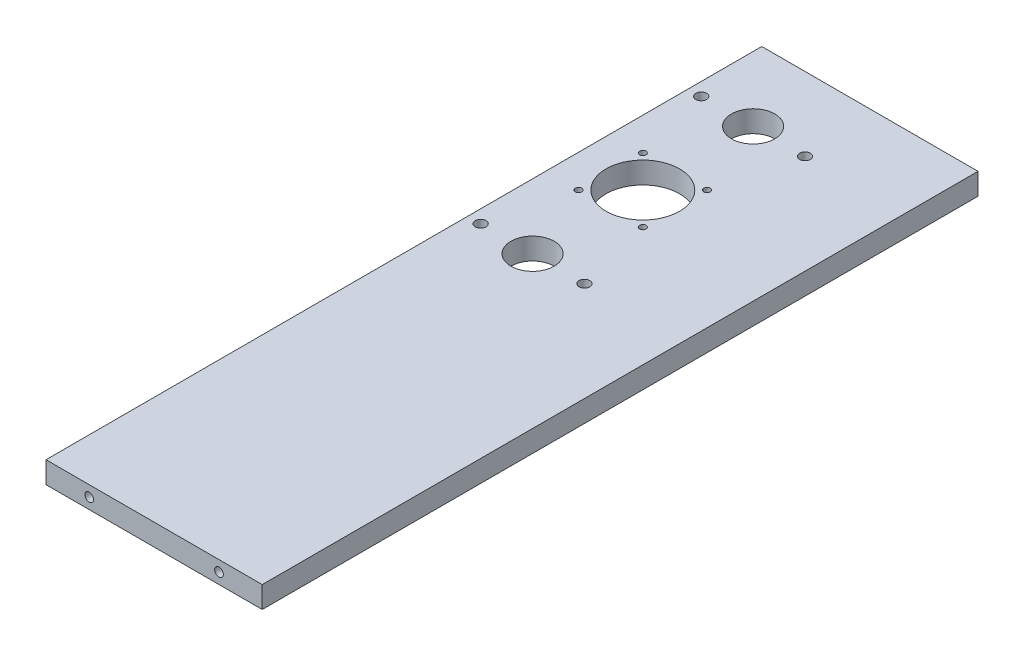
ISO-10303-21;
HEADER;
FILE_DESCRIPTION(('STEP AP214'),'2;1');
FILE_NAME('part.step','',(''),(''),'','','');
FILE_SCHEMA(('AUTOMOTIVE_DESIGN { 1 0 10303 214 1 1 1 1 }'));
ENDSEC;
DATA;
#1=APPLICATION_CONTEXT('core data for automotive mechanical design processes');
#2=APPLICATION_PROTOCOL_DEFINITION('international standard','automotive_design',2000,#1);
#3=PRODUCT_CONTEXT('',#1,'mechanical');
#4=PRODUCT('Part','Part','',(#3));
#5=PRODUCT_RELATED_PRODUCT_CATEGORY('part','',(#4));
#6=PRODUCT_DEFINITION_FORMATION('','',#4);
#7=PRODUCT_DEFINITION_CONTEXT('part definition',#1,'design');
#8=PRODUCT_DEFINITION('design','',#6,#7);
#9=PRODUCT_DEFINITION_SHAPE('','',#8);
#10=(LENGTH_UNIT() NAMED_UNIT(*) SI_UNIT(.MILLI.,.METRE.));
#11=(NAMED_UNIT(*) PLANE_ANGLE_UNIT() SI_UNIT($,.RADIAN.));
#12=(NAMED_UNIT(*) SI_UNIT($,.STERADIAN.) SOLID_ANGLE_UNIT());
#13=UNCERTAINTY_MEASURE_WITH_UNIT(LENGTH_MEASURE(1.E-05),#10,'distance_accuracy_value','');
#14=(GEOMETRIC_REPRESENTATION_CONTEXT(3) GLOBAL_UNCERTAINTY_ASSIGNED_CONTEXT((#13)) GLOBAL_UNIT_ASSIGNED_CONTEXT((#10,
#11,#12)) REPRESENTATION_CONTEXT('',''));
#15=CARTESIAN_POINT('',(0.,0.,0.));
#16=DIRECTION('',(0.,0.,1.));
#17=DIRECTION('',(1.,0.,0.));
#18=AXIS2_PLACEMENT_3D('',#15,#16,#17);
#19=CARTESIAN_POINT('',(-79.2239334984175,10.,-31.1640997523736));
#20=DIRECTION('',(0.,0.,1.));
#21=DIRECTION('',(1.,0.,0.));
#22=AXIS2_PLACEMENT_3D('',#19,#20,#21);
#23=PLANE('',#22);
#24=DIRECTION('',(-1.,0.,0.));
#25=VECTOR('',#24,1.);
#26=CARTESIAN_POINT('',(-79.2239334984175,0.,-31.1640997523736));
#27=LINE('',#26,#25);
#28=CARTESIAN_POINT('',(20.7760665015824,0.,-31.1640997523736));
#29=VERTEX_POINT('',#28);
#30=CARTESIAN_POINT('',(-79.2239334984175,0.,-31.1640997523736));
#31=VERTEX_POINT('',#30);
#32=EDGE_CURVE('E96',#29,#31,#27,.T.);
#33=ORIENTED_EDGE('',*,*,#32,.T.);
#34=DIRECTION('',(0.,-1.,0.));
#35=VECTOR('',#34,1.);
#36=CARTESIAN_POINT('',(-79.2239334984175,10.,-31.1640997523736));
#37=LINE('',#36,#35);
#38=CARTESIAN_POINT('',(-79.2239334984175,10.,-31.1640997523736));
#39=VERTEX_POINT('',#38);
#40=EDGE_CURVE('E11',#39,#31,#37,.T.);
#41=ORIENTED_EDGE('',*,*,#40,.F.);
#42=DIRECTION('',(-1.,0.,0.));
#43=VECTOR('',#42,1.);
#44=CARTESIAN_POINT('',(-79.2239334984175,10.,-31.1640997523736));
#45=LINE('',#44,#43);
#46=CARTESIAN_POINT('',(20.7760665015824,10.,-31.1640997523736));
#47=VERTEX_POINT('',#46);
#48=EDGE_CURVE('E84',#47,#39,#45,.T.);
#49=ORIENTED_EDGE('',*,*,#48,.F.);
#50=DIRECTION('',(0.,-1.,0.));
#51=VECTOR('',#50,1.);
#52=CARTESIAN_POINT('',(20.7760665015824,10.,-31.1640997523736));
#53=LINE('',#52,#51);
#54=EDGE_CURVE('E92',#47,#29,#53,.T.);
#55=ORIENTED_EDGE('',*,*,#54,.T.);
#56=EDGE_LOOP('',(#33,#41,#49,#55));
#57=FACE_BOUND('',#56,.T.);
#58=ADVANCED_FACE('F33',(#57),#23,.F.);
#59=CARTESIAN_POINT('',(-79.2239334984175,10.,299.835900247626));
#60=DIRECTION('',(1.,0.,0.));
#61=DIRECTION('',(0.,0.,-1.));
#62=AXIS2_PLACEMENT_3D('',#59,#60,#61);
#63=PLANE('',#62);
#64=DIRECTION('',(0.,0.,1.));
#65=VECTOR('',#64,1.);
#66=CARTESIAN_POINT('',(-79.2239334984175,0.,299.835900247626));
#67=LINE('',#66,#65);
#68=CARTESIAN_POINT('',(-79.2239334984175,0.,299.835900247626));
#69=VERTEX_POINT('',#68);
#70=EDGE_CURVE('E88',#31,#69,#67,.T.);
#71=ORIENTED_EDGE('',*,*,#70,.T.);
#72=DIRECTION('',(0.,-1.,0.));
#73=VECTOR('',#72,1.);
#74=CARTESIAN_POINT('',(-79.2239334984175,10.,299.835900247626));
#75=LINE('',#74,#73);
#76=CARTESIAN_POINT('',(-79.2239334984175,10.,299.835900247626));
#77=VERTEX_POINT('',#76);
#78=EDGE_CURVE('E41',#77,#69,#75,.T.);
#79=ORIENTED_EDGE('',*,*,#78,.F.);
#80=DIRECTION('',(0.,0.,1.));
#81=VECTOR('',#80,1.);
#82=CARTESIAN_POINT('',(-79.2239334984175,10.,299.835900247626));
#83=LINE('',#82,#81);
#84=EDGE_CURVE('E79',#39,#77,#83,.T.);
#85=ORIENTED_EDGE('',*,*,#84,.F.);
#86=ORIENTED_EDGE('',*,*,#40,.T.);
#87=EDGE_LOOP('',(#71,#79,#85,#86));
#88=FACE_BOUND('',#87,.T.);
#89=ADVANCED_FACE('F87',(#88),#63,.F.);
#90=CARTESIAN_POINT('',(20.7760665015825,10.,299.835900247626));
#91=DIRECTION('',(0.,0.,-1.));
#92=DIRECTION('',(-1.,0.,0.));
#93=AXIS2_PLACEMENT_3D('',#90,#91,#92);
#94=PLANE('',#93);
#95=CARTESIAN_POINT('',(0.776066501582462,5.,299.835900247626));
#96=DIRECTION('',(0.,0.,1.));
#97=DIRECTION('',(1.,0.,0.));
#98=AXIS2_PLACEMENT_3D('',#95,#96,#97);
#99=CIRCLE('',#98,2.);
#100=CARTESIAN_POINT('',(2.77606650158246,5.,299.835900247626));
#101=VERTEX_POINT('',#100);
#102=EDGE_CURVE('E182',#101,#101,#99,.T.);
#103=ORIENTED_EDGE('',*,*,#102,.F.);
#104=EDGE_LOOP('',(#103));
#105=FACE_BOUND('',#104,.T.);
#106=CARTESIAN_POINT('',(-59.2239334984175,5.,299.835900247626));
#107=DIRECTION('',(0.,0.,1.));
#108=DIRECTION('',(1.,0.,0.));
#109=AXIS2_PLACEMENT_3D('',#106,#107,#108);
#110=CIRCLE('',#109,2.);
#111=CARTESIAN_POINT('',(-57.2239334984175,5.,299.835900247626));
#112=VERTEX_POINT('',#111);
#113=EDGE_CURVE('E176',#112,#112,#110,.T.);
#114=ORIENTED_EDGE('',*,*,#113,.F.);
#115=EDGE_LOOP('',(#114));
#116=FACE_BOUND('',#115,.T.);
#117=DIRECTION('',(1.,0.,0.));
#118=VECTOR('',#117,1.);
#119=CARTESIAN_POINT('',(20.7760665015825,0.,299.835900247626));
#120=LINE('',#119,#118);
#121=CARTESIAN_POINT('',(20.7760665015825,0.,299.835900247626));
#122=VERTEX_POINT('',#121);
#123=EDGE_CURVE('E66',#69,#122,#120,.T.);
#124=ORIENTED_EDGE('',*,*,#123,.T.);
#125=DIRECTION('',(0.,-1.,0.));
#126=VECTOR('',#125,1.);
#127=CARTESIAN_POINT('',(20.7760665015825,10.,299.835900247626));
#128=LINE('',#127,#126);
#129=CARTESIAN_POINT('',(20.7760665015825,10.,299.835900247626));
#130=VERTEX_POINT('',#129);
#131=EDGE_CURVE('E89',#130,#122,#128,.T.);
#132=ORIENTED_EDGE('',*,*,#131,.F.);
#133=DIRECTION('',(1.,0.,0.));
#134=VECTOR('',#133,1.);
#135=CARTESIAN_POINT('',(20.7760665015825,10.,299.835900247626));
#136=LINE('',#135,#134);
#137=EDGE_CURVE('E82',#77,#130,#136,.T.);
#138=ORIENTED_EDGE('',*,*,#137,.F.);
#139=ORIENTED_EDGE('',*,*,#78,.T.);
#140=EDGE_LOOP('',(#124,#132,#138,#139));
#141=FACE_BOUND('',#140,.T.);
#142=ADVANCED_FACE('F90',(#105,#116,#141),#94,.F.);
#143=CARTESIAN_POINT('',(20.7760665015824,10.,-31.1640997523736));
#144=DIRECTION('',(-1.,0.,0.));
#145=DIRECTION('',(0.,0.,1.));
#146=AXIS2_PLACEMENT_3D('',#143,#144,#145);
#147=PLANE('',#146);
#148=DIRECTION('',(0.,0.,-1.));
#149=VECTOR('',#148,1.);
#150=CARTESIAN_POINT('',(20.7760665015824,0.,-31.1640997523736));
#151=LINE('',#150,#149);
#152=EDGE_CURVE('E72',#122,#29,#151,.T.);
#153=ORIENTED_EDGE('',*,*,#152,.T.);
#154=ORIENTED_EDGE('',*,*,#54,.F.);
#155=DIRECTION('',(0.,0.,-1.));
#156=VECTOR('',#155,1.);
#157=CARTESIAN_POINT('',(20.7760665015824,10.,-31.1640997523736));
#158=LINE('',#157,#156);
#159=EDGE_CURVE('E49',#130,#47,#158,.T.);
#160=ORIENTED_EDGE('',*,*,#159,.F.);
#161=ORIENTED_EDGE('',*,*,#131,.T.);
#162=EDGE_LOOP('',(#153,#154,#160,#161));
#163=FACE_BOUND('',#162,.T.);
#164=ADVANCED_FACE('F104',(#163),#147,.F.);
#165=CARTESIAN_POINT('',(0.,10.,0.));
#166=DIRECTION('',(0.,-1.,0.));
#167=DIRECTION('',(0.,0.,-1.));
#168=AXIS2_PLACEMENT_3D('',#165,#166,#167);
#169=PLANE('',#168);
#170=CARTESIAN_POINT('',(-64.073175903335,10.,68.6851426525439));
#171=DIRECTION('',(0.,1.,0.));
#172=DIRECTION('',(0.,0.,1.));
#173=AXIS2_PLACEMENT_3D('',#170,#171,#172);
#174=CIRCLE('',#173,1.5);
#175=CARTESIAN_POINT('',(-64.073175903335,10.,70.1851426525439));
#176=VERTEX_POINT('',#175);
#177=EDGE_CURVE('E170',#176,#176,#174,.T.);
#178=ORIENTED_EDGE('',*,*,#177,.F.);
#179=EDGE_LOOP('',(#178));
#180=FACE_BOUND('',#179,.T.);
#181=CARTESIAN_POINT('',(-34.3746910935,10.,68.6851426525439));
#182=DIRECTION('',(0.,1.,0.));
#183=DIRECTION('',(0.,0.,1.));
#184=AXIS2_PLACEMENT_3D('',#181,#182,#183);
#185=CIRCLE('',#184,1.5);
#186=CARTESIAN_POINT('',(-34.3746910935,10.,70.1851426525439));
#187=VERTEX_POINT('',#186);
#188=EDGE_CURVE('E164',#187,#187,#185,.T.);
#189=ORIENTED_EDGE('',*,*,#188,.F.);
#190=EDGE_LOOP('',(#189));
#191=FACE_BOUND('',#190,.T.);
#192=CARTESIAN_POINT('',(-34.3746910935,10.,38.9866578427089));
#193=DIRECTION('',(0.,1.,0.));
#194=DIRECTION('',(0.,0.,1.));
#195=AXIS2_PLACEMENT_3D('',#192,#193,#194);
#196=CIRCLE('',#195,1.5);
#197=CARTESIAN_POINT('',(-34.3746910935,10.,40.4866578427089));
#198=VERTEX_POINT('',#197);
#199=EDGE_CURVE('E158',#198,#198,#196,.T.);
#200=ORIENTED_EDGE('',*,*,#199,.F.);
#201=EDGE_LOOP('',(#200));
#202=FACE_BOUND('',#201,.T.);
#203=CARTESIAN_POINT('',(-64.073175903335,10.,38.9866578427089));
#204=DIRECTION('',(0.,1.,0.));
#205=DIRECTION('',(0.,0.,1.));
#206=AXIS2_PLACEMENT_3D('',#203,#204,#205);
#207=CIRCLE('',#206,1.5);
#208=CARTESIAN_POINT('',(-64.073175903335,10.,40.4866578427089));
#209=VERTEX_POINT('',#208);
#210=EDGE_CURVE('E152',#209,#209,#207,.T.);
#211=ORIENTED_EDGE('',*,*,#210,.F.);
#212=EDGE_LOOP('',(#211));
#213=FACE_BOUND('',#212,.T.);
#214=CARTESIAN_POINT('',(-25.2239334984175,10.,104.835900247626));
#215=DIRECTION('',(0.,1.,0.));
#216=DIRECTION('',(0.,0.,1.));
#217=AXIS2_PLACEMENT_3D('',#214,#215,#216);
#218=CIRCLE('',#217,2.5);
#219=CARTESIAN_POINT('',(-25.2239334984175,10.,107.335900247626));
#220=VERTEX_POINT('',#219);
#221=EDGE_CURVE('E146',#220,#220,#218,.T.);
#222=ORIENTED_EDGE('',*,*,#221,.F.);
#223=EDGE_LOOP('',(#222));
#224=FACE_BOUND('',#223,.T.);
#225=CARTESIAN_POINT('',(-73.2239334984175,10.,104.835900247626));
#226=DIRECTION('',(0.,1.,0.));
#227=DIRECTION('',(0.,0.,1.));
#228=AXIS2_PLACEMENT_3D('',#225,#226,#227);
#229=CIRCLE('',#228,2.50000000000001);
#230=CARTESIAN_POINT('',(-73.2239334984175,10.,107.335900247626));
#231=VERTEX_POINT('',#230);
#232=EDGE_CURVE('E140',#231,#231,#229,.T.);
#233=ORIENTED_EDGE('',*,*,#232,.F.);
#234=EDGE_LOOP('',(#233));
#235=FACE_BOUND('',#234,.T.);
#236=CARTESIAN_POINT('',(-49.2239334984175,10.,104.835900247626));
#237=DIRECTION('',(0.,1.,0.));
#238=DIRECTION('',(0.,0.,1.));
#239=AXIS2_PLACEMENT_3D('',#236,#237,#238);
#240=CIRCLE('',#239,10.);
#241=CARTESIAN_POINT('',(-49.2239334984175,10.,114.835900247626));
#242=VERTEX_POINT('',#241);
#243=EDGE_CURVE('E134',#242,#242,#240,.T.);
#244=ORIENTED_EDGE('',*,*,#243,.F.);
#245=EDGE_LOOP('',(#244));
#246=FACE_BOUND('',#245,.T.);
#247=CARTESIAN_POINT('',(-49.2239334984175,10.,53.8359002476264));
#248=DIRECTION('',(0.,1.,0.));
#249=DIRECTION('',(0.,0.,1.));
#250=AXIS2_PLACEMENT_3D('',#247,#248,#249);
#251=CIRCLE('',#250,17.);
#252=CARTESIAN_POINT('',(-49.2239334984175,10.,70.8359002476264));
#253=VERTEX_POINT('',#252);
#254=EDGE_CURVE('E128',#253,#253,#251,.T.);
#255=ORIENTED_EDGE('',*,*,#254,.F.);
#256=EDGE_LOOP('',(#255));
#257=FACE_BOUND('',#256,.T.);
#258=CARTESIAN_POINT('',(-25.2239334984175,10.,2.83590024762641));
#259=DIRECTION('',(0.,1.,0.));
#260=DIRECTION('',(0.,0.,1.));
#261=AXIS2_PLACEMENT_3D('',#258,#259,#260);
#262=CIRCLE('',#261,2.5);
#263=CARTESIAN_POINT('',(-25.2239334984175,10.,5.33590024762641));
#264=VERTEX_POINT('',#263);
#265=EDGE_CURVE('E122',#264,#264,#262,.T.);
#266=ORIENTED_EDGE('',*,*,#265,.F.);
#267=EDGE_LOOP('',(#266));
#268=FACE_BOUND('',#267,.T.);
#269=CARTESIAN_POINT('',(-73.2239334984176,10.,2.83590024762641));
#270=DIRECTION('',(0.,1.,0.));
#271=DIRECTION('',(0.,0.,1.));
#272=AXIS2_PLACEMENT_3D('',#269,#270,#271);
#273=CIRCLE('',#272,2.5);
#274=CARTESIAN_POINT('',(-73.2239334984176,10.,5.3359002476264));
#275=VERTEX_POINT('',#274);
#276=EDGE_CURVE('E116',#275,#275,#273,.T.);
#277=ORIENTED_EDGE('',*,*,#276,.F.);
#278=EDGE_LOOP('',(#277));
#279=FACE_BOUND('',#278,.T.);
#280=CARTESIAN_POINT('',(-49.2239334984175,10.,2.83590024762641));
#281=DIRECTION('',(0.,1.,0.));
#282=DIRECTION('',(0.,0.,1.));
#283=AXIS2_PLACEMENT_3D('',#280,#281,#282);
#284=CIRCLE('',#283,10.);
#285=CARTESIAN_POINT('',(-49.2239334984175,10.,12.8359002476264));
#286=VERTEX_POINT('',#285);
#287=EDGE_CURVE('E110',#286,#286,#284,.T.);
#288=ORIENTED_EDGE('',*,*,#287,.F.);
#289=EDGE_LOOP('',(#288));
#290=FACE_BOUND('',#289,.T.);
#291=ORIENTED_EDGE('',*,*,#48,.T.);
#292=ORIENTED_EDGE('',*,*,#84,.T.);
#293=ORIENTED_EDGE('',*,*,#137,.T.);
#294=ORIENTED_EDGE('',*,*,#159,.T.);
#295=EDGE_LOOP('',(#291,#292,#293,#294));
#296=FACE_BOUND('',#295,.T.);
#297=ADVANCED_FACE('F80',(#180,#191,#202,#213,#224,#235,#246,#257,#268,#279,#290,#296),#169,.F.);
#298=CARTESIAN_POINT('',(0.,0.,0.));
#299=DIRECTION('',(0.,-1.,0.));
#300=DIRECTION('',(0.,0.,-1.));
#301=AXIS2_PLACEMENT_3D('',#298,#299,#300);
#302=PLANE('',#301);
#303=CARTESIAN_POINT('',(-64.073175903335,0.,68.6851426525439));
#304=DIRECTION('',(0.,1.,0.));
#305=DIRECTION('',(0.,0.,1.));
#306=AXIS2_PLACEMENT_3D('',#303,#304,#305);
#307=CIRCLE('',#306,1.5);
#308=CARTESIAN_POINT('',(-64.073175903335,0.,70.1851426525439));
#309=VERTEX_POINT('',#308);
#310=EDGE_CURVE('E167',#309,#309,#307,.T.);
#311=ORIENTED_EDGE('',*,*,#310,.T.);
#312=EDGE_LOOP('',(#311));
#313=FACE_BOUND('',#312,.T.);
#314=CARTESIAN_POINT('',(-34.3746910935,0.,68.6851426525439));
#315=DIRECTION('',(0.,1.,0.));
#316=DIRECTION('',(0.,0.,1.));
#317=AXIS2_PLACEMENT_3D('',#314,#315,#316);
#318=CIRCLE('',#317,1.5);
#319=CARTESIAN_POINT('',(-34.3746910935,0.,70.1851426525439));
#320=VERTEX_POINT('',#319);
#321=EDGE_CURVE('E161',#320,#320,#318,.T.);
#322=ORIENTED_EDGE('',*,*,#321,.T.);
#323=EDGE_LOOP('',(#322));
#324=FACE_BOUND('',#323,.T.);
#325=CARTESIAN_POINT('',(-34.3746910935,0.,38.9866578427089));
#326=DIRECTION('',(0.,1.,0.));
#327=DIRECTION('',(0.,0.,1.));
#328=AXIS2_PLACEMENT_3D('',#325,#326,#327);
#329=CIRCLE('',#328,1.5);
#330=CARTESIAN_POINT('',(-34.3746910935,0.,40.4866578427089));
#331=VERTEX_POINT('',#330);
#332=EDGE_CURVE('E155',#331,#331,#329,.T.);
#333=ORIENTED_EDGE('',*,*,#332,.T.);
#334=EDGE_LOOP('',(#333));
#335=FACE_BOUND('',#334,.T.);
#336=CARTESIAN_POINT('',(-64.073175903335,0.,38.9866578427089));
#337=DIRECTION('',(0.,1.,0.));
#338=DIRECTION('',(0.,0.,1.));
#339=AXIS2_PLACEMENT_3D('',#336,#337,#338);
#340=CIRCLE('',#339,1.5);
#341=CARTESIAN_POINT('',(-64.073175903335,0.,40.4866578427089));
#342=VERTEX_POINT('',#341);
#343=EDGE_CURVE('E149',#342,#342,#340,.T.);
#344=ORIENTED_EDGE('',*,*,#343,.T.);
#345=EDGE_LOOP('',(#344));
#346=FACE_BOUND('',#345,.T.);
#347=CARTESIAN_POINT('',(-25.2239334984175,0.,104.835900247626));
#348=DIRECTION('',(0.,1.,0.));
#349=DIRECTION('',(0.,0.,1.));
#350=AXIS2_PLACEMENT_3D('',#347,#348,#349);
#351=CIRCLE('',#350,2.5);
#352=CARTESIAN_POINT('',(-25.2239334984175,0.,107.335900247626));
#353=VERTEX_POINT('',#352);
#354=EDGE_CURVE('E143',#353,#353,#351,.T.);
#355=ORIENTED_EDGE('',*,*,#354,.T.);
#356=EDGE_LOOP('',(#355));
#357=FACE_BOUND('',#356,.T.);
#358=CARTESIAN_POINT('',(-73.2239334984175,0.,104.835900247626));
#359=DIRECTION('',(0.,1.,0.));
#360=DIRECTION('',(0.,0.,1.));
#361=AXIS2_PLACEMENT_3D('',#358,#359,#360);
#362=CIRCLE('',#361,2.50000000000001);
#363=CARTESIAN_POINT('',(-73.2239334984175,0.,107.335900247626));
#364=VERTEX_POINT('',#363);
#365=EDGE_CURVE('E137',#364,#364,#362,.T.);
#366=ORIENTED_EDGE('',*,*,#365,.T.);
#367=EDGE_LOOP('',(#366));
#368=FACE_BOUND('',#367,.T.);
#369=CARTESIAN_POINT('',(-49.2239334984175,0.,104.835900247626));
#370=DIRECTION('',(0.,1.,0.));
#371=DIRECTION('',(0.,0.,1.));
#372=AXIS2_PLACEMENT_3D('',#369,#370,#371);
#373=CIRCLE('',#372,10.);
#374=CARTESIAN_POINT('',(-49.2239334984175,0.,114.835900247626));
#375=VERTEX_POINT('',#374);
#376=EDGE_CURVE('E131',#375,#375,#373,.T.);
#377=ORIENTED_EDGE('',*,*,#376,.T.);
#378=EDGE_LOOP('',(#377));
#379=FACE_BOUND('',#378,.T.);
#380=CARTESIAN_POINT('',(-49.2239334984175,0.,53.8359002476264));
#381=DIRECTION('',(0.,1.,0.));
#382=DIRECTION('',(0.,0.,1.));
#383=AXIS2_PLACEMENT_3D('',#380,#381,#382);
#384=CIRCLE('',#383,17.);
#385=CARTESIAN_POINT('',(-49.2239334984175,0.,70.8359002476264));
#386=VERTEX_POINT('',#385);
#387=EDGE_CURVE('E125',#386,#386,#384,.T.);
#388=ORIENTED_EDGE('',*,*,#387,.T.);
#389=EDGE_LOOP('',(#388));
#390=FACE_BOUND('',#389,.T.);
#391=CARTESIAN_POINT('',(-25.2239334984175,0.,2.83590024762641));
#392=DIRECTION('',(0.,1.,0.));
#393=DIRECTION('',(0.,0.,1.));
#394=AXIS2_PLACEMENT_3D('',#391,#392,#393);
#395=CIRCLE('',#394,2.5);
#396=CARTESIAN_POINT('',(-25.2239334984175,0.,5.33590024762641));
#397=VERTEX_POINT('',#396);
#398=EDGE_CURVE('E119',#397,#397,#395,.T.);
#399=ORIENTED_EDGE('',*,*,#398,.T.);
#400=EDGE_LOOP('',(#399));
#401=FACE_BOUND('',#400,.T.);
#402=CARTESIAN_POINT('',(-73.2239334984176,0.,2.83590024762641));
#403=DIRECTION('',(0.,1.,0.));
#404=DIRECTION('',(0.,0.,1.));
#405=AXIS2_PLACEMENT_3D('',#402,#403,#404);
#406=CIRCLE('',#405,2.5);
#407=CARTESIAN_POINT('',(-73.2239334984176,0.,5.3359002476264));
#408=VERTEX_POINT('',#407);
#409=EDGE_CURVE('E113',#408,#408,#406,.T.);
#410=ORIENTED_EDGE('',*,*,#409,.T.);
#411=EDGE_LOOP('',(#410));
#412=FACE_BOUND('',#411,.T.);
#413=CARTESIAN_POINT('',(-49.2239334984175,0.,2.83590024762641));
#414=DIRECTION('',(0.,1.,0.));
#415=DIRECTION('',(0.,0.,1.));
#416=AXIS2_PLACEMENT_3D('',#413,#414,#415);
#417=CIRCLE('',#416,10.);
#418=CARTESIAN_POINT('',(-49.2239334984175,0.,12.8359002476264));
#419=VERTEX_POINT('',#418);
#420=EDGE_CURVE('E99',#419,#419,#417,.T.);
#421=ORIENTED_EDGE('',*,*,#420,.T.);
#422=EDGE_LOOP('',(#421));
#423=FACE_BOUND('',#422,.T.);
#424=ORIENTED_EDGE('',*,*,#32,.F.);
#425=ORIENTED_EDGE('',*,*,#152,.F.);
#426=ORIENTED_EDGE('',*,*,#123,.F.);
#427=ORIENTED_EDGE('',*,*,#70,.F.);
#428=EDGE_LOOP('',(#424,#425,#426,#427));
#429=FACE_BOUND('',#428,.T.);
#430=ADVANCED_FACE('F107',(#313,#324,#335,#346,#357,#368,#379,#390,#401,#412,#423,#429),#302,.T.);
#431=CARTESIAN_POINT('',(-49.2239334984175,0.,2.83590024762641));
#432=DIRECTION('',(0.,1.,0.));
#433=DIRECTION('',(0.,0.,1.));
#434=AXIS2_PLACEMENT_3D('',#431,#432,#433);
#435=CYLINDRICAL_SURFACE('',#434,10.);
#436=ORIENTED_EDGE('',*,*,#420,.F.);
#437=EDGE_LOOP('',(#436));
#438=FACE_BOUND('',#437,.T.);
#439=ORIENTED_EDGE('',*,*,#287,.T.);
#440=EDGE_LOOP('',(#439));
#441=FACE_BOUND('',#440,.T.);
#442=ADVANCED_FACE('F228',(#438,#441),#435,.F.);
#443=CARTESIAN_POINT('',(-73.2239334984176,0.,2.83590024762641));
#444=DIRECTION('',(0.,1.,0.));
#445=DIRECTION('',(0.,0.,1.));
#446=AXIS2_PLACEMENT_3D('',#443,#444,#445);
#447=CYLINDRICAL_SURFACE('',#446,2.5);
#448=ORIENTED_EDGE('',*,*,#409,.F.);
#449=EDGE_LOOP('',(#448));
#450=FACE_BOUND('',#449,.T.);
#451=ORIENTED_EDGE('',*,*,#276,.T.);
#452=EDGE_LOOP('',(#451));
#453=FACE_BOUND('',#452,.T.);
#454=ADVANCED_FACE('F235',(#450,#453),#447,.F.);
#455=CARTESIAN_POINT('',(-25.2239334984175,0.,2.83590024762641));
#456=DIRECTION('',(0.,1.,0.));
#457=DIRECTION('',(0.,0.,1.));
#458=AXIS2_PLACEMENT_3D('',#455,#456,#457);
#459=CYLINDRICAL_SURFACE('',#458,2.5);
#460=ORIENTED_EDGE('',*,*,#398,.F.);
#461=EDGE_LOOP('',(#460));
#462=FACE_BOUND('',#461,.T.);
#463=ORIENTED_EDGE('',*,*,#265,.T.);
#464=EDGE_LOOP('',(#463));
#465=FACE_BOUND('',#464,.T.);
#466=ADVANCED_FACE('F239',(#462,#465),#459,.F.);
#467=CARTESIAN_POINT('',(-49.2239334984175,0.,53.8359002476264));
#468=DIRECTION('',(0.,1.,0.));
#469=DIRECTION('',(0.,0.,1.));
#470=AXIS2_PLACEMENT_3D('',#467,#468,#469);
#471=CYLINDRICAL_SURFACE('',#470,17.);
#472=ORIENTED_EDGE('',*,*,#387,.F.);
#473=EDGE_LOOP('',(#472));
#474=FACE_BOUND('',#473,.T.);
#475=ORIENTED_EDGE('',*,*,#254,.T.);
#476=EDGE_LOOP('',(#475));
#477=FACE_BOUND('',#476,.T.);
#478=ADVANCED_FACE('F243',(#474,#477),#471,.F.);
#479=CARTESIAN_POINT('',(-49.2239334984175,0.,104.835900247626));
#480=DIRECTION('',(0.,1.,0.));
#481=DIRECTION('',(0.,0.,1.));
#482=AXIS2_PLACEMENT_3D('',#479,#480,#481);
#483=CYLINDRICAL_SURFACE('',#482,10.);
#484=ORIENTED_EDGE('',*,*,#376,.F.);
#485=EDGE_LOOP('',(#484));
#486=FACE_BOUND('',#485,.T.);
#487=ORIENTED_EDGE('',*,*,#243,.T.);
#488=EDGE_LOOP('',(#487));
#489=FACE_BOUND('',#488,.T.);
#490=ADVANCED_FACE('F247',(#486,#489),#483,.F.);
#491=CARTESIAN_POINT('',(-73.2239334984175,0.,104.835900247626));
#492=DIRECTION('',(0.,1.,0.));
#493=DIRECTION('',(0.,0.,1.));
#494=AXIS2_PLACEMENT_3D('',#491,#492,#493);
#495=CYLINDRICAL_SURFACE('',#494,2.50000000000001);
#496=ORIENTED_EDGE('',*,*,#365,.F.);
#497=EDGE_LOOP('',(#496));
#498=FACE_BOUND('',#497,.T.);
#499=ORIENTED_EDGE('',*,*,#232,.T.);
#500=EDGE_LOOP('',(#499));
#501=FACE_BOUND('',#500,.T.);
#502=ADVANCED_FACE('F251',(#498,#501),#495,.F.);
#503=CARTESIAN_POINT('',(-25.2239334984175,0.,104.835900247626));
#504=DIRECTION('',(0.,1.,0.));
#505=DIRECTION('',(0.,0.,1.));
#506=AXIS2_PLACEMENT_3D('',#503,#504,#505);
#507=CYLINDRICAL_SURFACE('',#506,2.5);
#508=ORIENTED_EDGE('',*,*,#354,.F.);
#509=EDGE_LOOP('',(#508));
#510=FACE_BOUND('',#509,.T.);
#511=ORIENTED_EDGE('',*,*,#221,.T.);
#512=EDGE_LOOP('',(#511));
#513=FACE_BOUND('',#512,.T.);
#514=ADVANCED_FACE('F255',(#510,#513),#507,.F.);
#515=CARTESIAN_POINT('',(-64.073175903335,0.,38.9866578427089));
#516=DIRECTION('',(0.,1.,0.));
#517=DIRECTION('',(0.,0.,1.));
#518=AXIS2_PLACEMENT_3D('',#515,#516,#517);
#519=CYLINDRICAL_SURFACE('',#518,1.5);
#520=ORIENTED_EDGE('',*,*,#343,.F.);
#521=EDGE_LOOP('',(#520));
#522=FACE_BOUND('',#521,.T.);
#523=ORIENTED_EDGE('',*,*,#210,.T.);
#524=EDGE_LOOP('',(#523));
#525=FACE_BOUND('',#524,.T.);
#526=ADVANCED_FACE('F259',(#522,#525),#519,.F.);
#527=CARTESIAN_POINT('',(-34.3746910935,0.,38.9866578427089));
#528=DIRECTION('',(0.,1.,0.));
#529=DIRECTION('',(0.,0.,1.));
#530=AXIS2_PLACEMENT_3D('',#527,#528,#529);
#531=CYLINDRICAL_SURFACE('',#530,1.5);
#532=ORIENTED_EDGE('',*,*,#332,.F.);
#533=EDGE_LOOP('',(#532));
#534=FACE_BOUND('',#533,.T.);
#535=ORIENTED_EDGE('',*,*,#199,.T.);
#536=EDGE_LOOP('',(#535));
#537=FACE_BOUND('',#536,.T.);
#538=ADVANCED_FACE('F263',(#534,#537),#531,.F.);
#539=CARTESIAN_POINT('',(-34.3746910935,0.,68.6851426525439));
#540=DIRECTION('',(0.,1.,0.));
#541=DIRECTION('',(0.,0.,1.));
#542=AXIS2_PLACEMENT_3D('',#539,#540,#541);
#543=CYLINDRICAL_SURFACE('',#542,1.5);
#544=ORIENTED_EDGE('',*,*,#321,.F.);
#545=EDGE_LOOP('',(#544));
#546=FACE_BOUND('',#545,.T.);
#547=ORIENTED_EDGE('',*,*,#188,.T.);
#548=EDGE_LOOP('',(#547));
#549=FACE_BOUND('',#548,.T.);
#550=ADVANCED_FACE('F213',(#546,#549),#543,.F.);
#551=CARTESIAN_POINT('',(-64.073175903335,0.,68.6851426525439));
#552=DIRECTION('',(0.,1.,0.));
#553=DIRECTION('',(0.,0.,1.));
#554=AXIS2_PLACEMENT_3D('',#551,#552,#553);
#555=CYLINDRICAL_SURFACE('',#554,1.5);
#556=ORIENTED_EDGE('',*,*,#310,.F.);
#557=EDGE_LOOP('',(#556));
#558=FACE_BOUND('',#557,.T.);
#559=ORIENTED_EDGE('',*,*,#177,.T.);
#560=EDGE_LOOP('',(#559));
#561=FACE_BOUND('',#560,.T.);
#562=ADVANCED_FACE('F204',(#558,#561),#555,.F.);
#563=CARTESIAN_POINT('',(-59.2239334984175,5.,284.835900247626));
#564=DIRECTION('',(0.,0.,1.));
#565=DIRECTION('',(1.,0.,0.));
#566=AXIS2_PLACEMENT_3D('',#563,#564,#565);
#567=CYLINDRICAL_SURFACE('',#566,2.);
#568=CARTESIAN_POINT('',(-59.2239334984175,5.,284.835900247626));
#569=DIRECTION('',(0.,0.,1.));
#570=DIRECTION('',(1.,0.,0.));
#571=AXIS2_PLACEMENT_3D('',#568,#569,#570);
#572=CIRCLE('',#571,2.);
#573=CARTESIAN_POINT('',(-57.2239334984175,5.,284.835900247626));
#574=VERTEX_POINT('',#573);
#575=EDGE_CURVE('E173',#574,#574,#572,.T.);
#576=ORIENTED_EDGE('',*,*,#575,.F.);
#577=EDGE_LOOP('',(#576));
#578=FACE_BOUND('',#577,.T.);
#579=ORIENTED_EDGE('',*,*,#113,.T.);
#580=EDGE_LOOP('',(#579));
#581=FACE_BOUND('',#580,.T.);
#582=ADVANCED_FACE('F202',(#578,#581),#567,.F.);
#583=CARTESIAN_POINT('',(-59.2239334984175,5.,284.835900247626));
#584=DIRECTION('',(0.,0.,1.));
#585=DIRECTION('',(1.,0.,0.));
#586=AXIS2_PLACEMENT_3D('',#583,#584,#585);
#587=PLANE('',#586);
#588=ORIENTED_EDGE('',*,*,#575,.T.);
#589=EDGE_LOOP('',(#588));
#590=FACE_BOUND('',#589,.T.);
#591=ADVANCED_FACE('F193',(#590),#587,.T.);
#592=CARTESIAN_POINT('',(0.776066501582462,5.,284.835900247626));
#593=DIRECTION('',(0.,0.,1.));
#594=DIRECTION('',(1.,0.,0.));
#595=AXIS2_PLACEMENT_3D('',#592,#593,#594);
#596=CYLINDRICAL_SURFACE('',#595,2.);
#597=CARTESIAN_POINT('',(0.776066501582462,5.,284.835900247626));
#598=DIRECTION('',(0.,0.,1.));
#599=DIRECTION('',(1.,0.,0.));
#600=AXIS2_PLACEMENT_3D('',#597,#598,#599);
#601=CIRCLE('',#600,2.);
#602=CARTESIAN_POINT('',(2.77606650158246,5.,284.835900247626));
#603=VERTEX_POINT('',#602);
#604=EDGE_CURVE('E179',#603,#603,#601,.T.);
#605=ORIENTED_EDGE('',*,*,#604,.F.);
#606=EDGE_LOOP('',(#605));
#607=FACE_BOUND('',#606,.T.);
#608=ORIENTED_EDGE('',*,*,#102,.T.);
#609=EDGE_LOOP('',(#608));
#610=FACE_BOUND('',#609,.T.);
#611=ADVANCED_FACE('F190',(#607,#610),#596,.F.);
#612=CARTESIAN_POINT('',(0.776066501582462,5.,284.835900247626));
#613=DIRECTION('',(0.,0.,1.));
#614=DIRECTION('',(1.,0.,0.));
#615=AXIS2_PLACEMENT_3D('',#612,#613,#614);
#616=PLANE('',#615);
#617=ORIENTED_EDGE('',*,*,#604,.T.);
#618=EDGE_LOOP('',(#617));
#619=FACE_BOUND('',#618,.T.);
#620=ADVANCED_FACE('F188',(#619),#616,.T.);
#621=CLOSED_SHELL('',(#58,#89,#142,#164,#297,#430,#442,#454,#466,#478,#490,#502,#514,#526,#538,
#550,#562,#582,#591,#611,#620));
#622=MANIFOLD_SOLID_BREP('B2',#621);
#623=ADVANCED_BREP_SHAPE_REPRESENTATION('',(#18,#622),#14);
#624=SHAPE_DEFINITION_REPRESENTATION(#9,#623);
ENDSEC;
END-ISO-10303-21;
